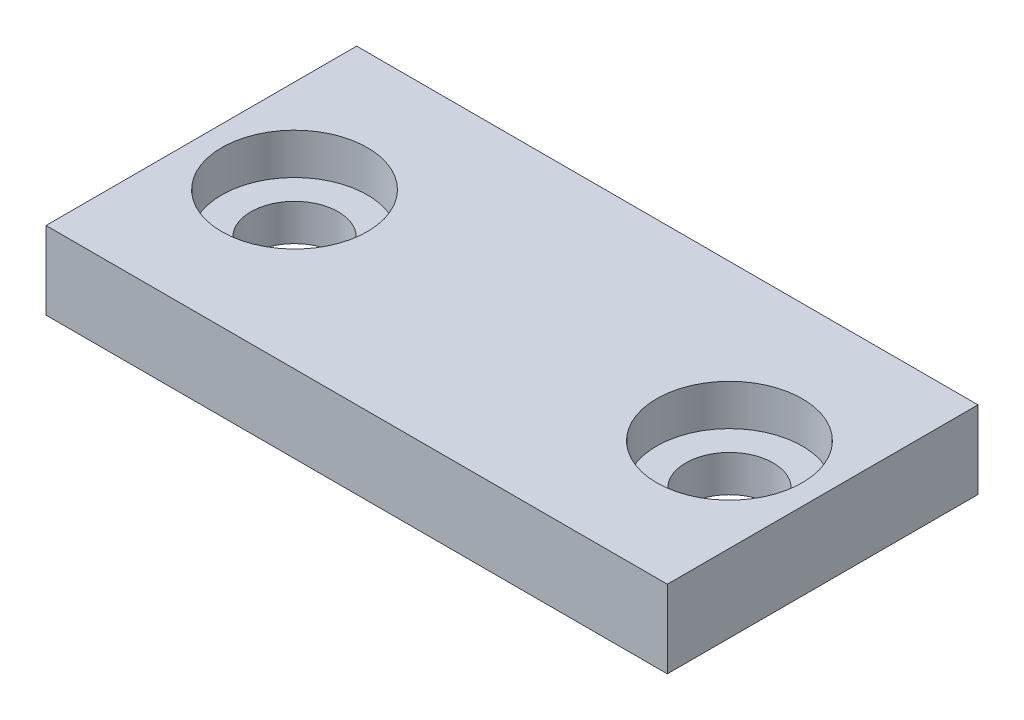
ISO-10303-21;
HEADER;
FILE_DESCRIPTION(('STEP AP214'),'2;1');
FILE_NAME('part.step','',(''),(''),'','','');
FILE_SCHEMA(('AUTOMOTIVE_DESIGN { 1 0 10303 214 1 1 1 1 }'));
ENDSEC;
DATA;
#1=APPLICATION_CONTEXT('core data for automotive mechanical design processes');
#2=APPLICATION_PROTOCOL_DEFINITION('international standard','automotive_design',2000,#1);
#3=PRODUCT_CONTEXT('',#1,'mechanical');
#4=PRODUCT('Part','Part','',(#3));
#5=PRODUCT_RELATED_PRODUCT_CATEGORY('part','',(#4));
#6=PRODUCT_DEFINITION_FORMATION('','',#4);
#7=PRODUCT_DEFINITION_CONTEXT('part definition',#1,'design');
#8=PRODUCT_DEFINITION('design','',#6,#7);
#9=PRODUCT_DEFINITION_SHAPE('','',#8);
#10=(LENGTH_UNIT() NAMED_UNIT(*) SI_UNIT(.MILLI.,.METRE.));
#11=(NAMED_UNIT(*) PLANE_ANGLE_UNIT() SI_UNIT($,.RADIAN.));
#12=(NAMED_UNIT(*) SI_UNIT($,.STERADIAN.) SOLID_ANGLE_UNIT());
#13=UNCERTAINTY_MEASURE_WITH_UNIT(LENGTH_MEASURE(1.E-05),#10,'distance_accuracy_value','');
#14=(GEOMETRIC_REPRESENTATION_CONTEXT(3) GLOBAL_UNCERTAINTY_ASSIGNED_CONTEXT((#13)) GLOBAL_UNIT_ASSIGNED_CONTEXT((#10,
#11,#12)) REPRESENTATION_CONTEXT('',''));
#15=CARTESIAN_POINT('',(0.,0.,0.));
#16=DIRECTION('',(0.,0.,1.));
#17=DIRECTION('',(1.,0.,0.));
#18=AXIS2_PLACEMENT_3D('',#15,#16,#17);
#19=CARTESIAN_POINT('',(0.,6.35,0.));
#20=DIRECTION('',(1.,0.,0.));
#21=DIRECTION('',(0.,0.,-1.));
#22=AXIS2_PLACEMENT_3D('',#19,#20,#21);
#23=PLANE('',#22);
#24=DIRECTION('',(0.,0.,1.));
#25=VECTOR('',#24,1.);
#26=CARTESIAN_POINT('',(0.,0.,0.));
#27=LINE('',#26,#25);
#28=CARTESIAN_POINT('',(0.,0.,-25.4));
#29=VERTEX_POINT('',#28);
#30=CARTESIAN_POINT('',(0.,0.,0.));
#31=VERTEX_POINT('',#30);
#32=EDGE_CURVE('E96',#29,#31,#27,.T.);
#33=ORIENTED_EDGE('',*,*,#32,.T.);
#34=DIRECTION('',(0.,-1.,0.));
#35=VECTOR('',#34,1.);
#36=CARTESIAN_POINT('',(0.,6.35,0.));
#37=LINE('',#36,#35);
#38=CARTESIAN_POINT('',(0.,6.35,0.));
#39=VERTEX_POINT('',#38);
#40=EDGE_CURVE('E11',#39,#31,#37,.T.);
#41=ORIENTED_EDGE('',*,*,#40,.F.);
#42=DIRECTION('',(0.,0.,1.));
#43=VECTOR('',#42,1.);
#44=CARTESIAN_POINT('',(0.,6.35,0.));
#45=LINE('',#44,#43);
#46=CARTESIAN_POINT('',(0.,6.35,-25.4));
#47=VERTEX_POINT('',#46);
#48=EDGE_CURVE('E84',#47,#39,#45,.T.);
#49=ORIENTED_EDGE('',*,*,#48,.F.);
#50=DIRECTION('',(0.,-1.,0.));
#51=VECTOR('',#50,1.);
#52=CARTESIAN_POINT('',(0.,6.35,-25.4));
#53=LINE('',#52,#51);
#54=EDGE_CURVE('E92',#47,#29,#53,.T.);
#55=ORIENTED_EDGE('',*,*,#54,.T.);
#56=EDGE_LOOP('',(#33,#41,#49,#55));
#57=FACE_BOUND('',#56,.T.);
#58=ADVANCED_FACE('F33',(#57),#23,.F.);
#59=CARTESIAN_POINT('',(0.,6.35,0.));
#60=DIRECTION('',(0.,0.,-1.));
#61=DIRECTION('',(-1.,0.,0.));
#62=AXIS2_PLACEMENT_3D('',#59,#60,#61);
#63=PLANE('',#62);
#64=DIRECTION('',(1.,0.,0.));
#65=VECTOR('',#64,1.);
#66=CARTESIAN_POINT('',(0.,0.,0.));
#67=LINE('',#66,#65);
#68=CARTESIAN_POINT('',(50.8,0.,0.));
#69=VERTEX_POINT('',#68);
#70=EDGE_CURVE('E88',#31,#69,#67,.T.);
#71=ORIENTED_EDGE('',*,*,#70,.T.);
#72=DIRECTION('',(0.,-1.,0.));
#73=VECTOR('',#72,1.);
#74=CARTESIAN_POINT('',(50.8,6.35,0.));
#75=LINE('',#74,#73);
#76=CARTESIAN_POINT('',(50.8,6.35,0.));
#77=VERTEX_POINT('',#76);
#78=EDGE_CURVE('E41',#77,#69,#75,.T.);
#79=ORIENTED_EDGE('',*,*,#78,.F.);
#80=DIRECTION('',(1.,0.,0.));
#81=VECTOR('',#80,1.);
#82=CARTESIAN_POINT('',(0.,6.35,0.));
#83=LINE('',#82,#81);
#84=EDGE_CURVE('E79',#39,#77,#83,.T.);
#85=ORIENTED_EDGE('',*,*,#84,.F.);
#86=ORIENTED_EDGE('',*,*,#40,.T.);
#87=EDGE_LOOP('',(#71,#79,#85,#86));
#88=FACE_BOUND('',#87,.T.);
#89=ADVANCED_FACE('F87',(#88),#63,.F.);
#90=CARTESIAN_POINT('',(50.8,6.35,0.));
#91=DIRECTION('',(-1.,0.,0.));
#92=DIRECTION('',(0.,0.,1.));
#93=AXIS2_PLACEMENT_3D('',#90,#91,#92);
#94=PLANE('',#93);
#95=DIRECTION('',(0.,0.,-1.));
#96=VECTOR('',#95,1.);
#97=CARTESIAN_POINT('',(50.8,0.,0.));
#98=LINE('',#97,#96);
#99=CARTESIAN_POINT('',(50.8,0.,-25.4));
#100=VERTEX_POINT('',#99);
#101=EDGE_CURVE('E66',#69,#100,#98,.T.);
#102=ORIENTED_EDGE('',*,*,#101,.T.);
#103=DIRECTION('',(0.,-1.,0.));
#104=VECTOR('',#103,1.);
#105=CARTESIAN_POINT('',(50.8,6.35,-25.4));
#106=LINE('',#105,#104);
#107=CARTESIAN_POINT('',(50.8,6.35,-25.4));
#108=VERTEX_POINT('',#107);
#109=EDGE_CURVE('E89',#108,#100,#106,.T.);
#110=ORIENTED_EDGE('',*,*,#109,.F.);
#111=DIRECTION('',(0.,0.,-1.));
#112=VECTOR('',#111,1.);
#113=CARTESIAN_POINT('',(50.8,6.35,0.));
#114=LINE('',#113,#112);
#115=EDGE_CURVE('E82',#77,#108,#114,.T.);
#116=ORIENTED_EDGE('',*,*,#115,.F.);
#117=ORIENTED_EDGE('',*,*,#78,.T.);
#118=EDGE_LOOP('',(#102,#110,#116,#117));
#119=FACE_BOUND('',#118,.T.);
#120=ADVANCED_FACE('F90',(#119),#94,.F.);
#121=CARTESIAN_POINT('',(0.,6.35,-25.4));
#122=DIRECTION('',(0.,0.,1.));
#123=DIRECTION('',(1.,0.,0.));
#124=AXIS2_PLACEMENT_3D('',#121,#122,#123);
#125=PLANE('',#124);
#126=DIRECTION('',(-1.,0.,0.));
#127=VECTOR('',#126,1.);
#128=CARTESIAN_POINT('',(0.,0.,-25.4));
#129=LINE('',#128,#127);
#130=EDGE_CURVE('E72',#100,#29,#129,.T.);
#131=ORIENTED_EDGE('',*,*,#130,.T.);
#132=ORIENTED_EDGE('',*,*,#54,.F.);
#133=DIRECTION('',(-1.,0.,0.));
#134=VECTOR('',#133,1.);
#135=CARTESIAN_POINT('',(0.,6.35,-25.4));
#136=LINE('',#135,#134);
#137=EDGE_CURVE('E49',#108,#47,#136,.T.);
#138=ORIENTED_EDGE('',*,*,#137,.F.);
#139=ORIENTED_EDGE('',*,*,#109,.T.);
#140=EDGE_LOOP('',(#131,#132,#138,#139));
#141=FACE_BOUND('',#140,.T.);
#142=ADVANCED_FACE('F104',(#141),#125,.F.);
#143=CARTESIAN_POINT('',(0.,6.35,0.));
#144=DIRECTION('',(0.,-1.,0.));
#145=DIRECTION('',(0.,0.,-1.));
#146=AXIS2_PLACEMENT_3D('',#143,#144,#145);
#147=PLANE('',#146);
#148=CARTESIAN_POINT('',(7.62,6.35,-12.7));
#149=DIRECTION('',(0.,1.,0.));
#150=DIRECTION('',(0.,0.,1.));
#151=AXIS2_PLACEMENT_3D('',#148,#149,#150);
#152=CIRCLE('',#151,5.95376);
#153=CARTESIAN_POINT('',(7.62,6.35,-6.74624));
#154=VERTEX_POINT('',#153);
#155=EDGE_CURVE('E130',#154,#154,#152,.T.);
#156=ORIENTED_EDGE('',*,*,#155,.F.);
#157=EDGE_LOOP('',(#156));
#158=FACE_BOUND('',#157,.T.);
#159=CARTESIAN_POINT('',(43.18,6.35,-12.7));
#160=DIRECTION('',(0.,1.,0.));
#161=DIRECTION('',(0.,0.,1.));
#162=AXIS2_PLACEMENT_3D('',#159,#160,#161);
#163=CIRCLE('',#162,5.95376);
#164=CARTESIAN_POINT('',(43.18,6.35,-6.74624));
#165=VERTEX_POINT('',#164);
#166=EDGE_CURVE('E118',#165,#165,#163,.T.);
#167=ORIENTED_EDGE('',*,*,#166,.F.);
#168=EDGE_LOOP('',(#167));
#169=FACE_BOUND('',#168,.T.);
#170=ORIENTED_EDGE('',*,*,#48,.T.);
#171=ORIENTED_EDGE('',*,*,#84,.T.);
#172=ORIENTED_EDGE('',*,*,#115,.T.);
#173=ORIENTED_EDGE('',*,*,#137,.T.);
#174=EDGE_LOOP('',(#170,#171,#172,#173));
#175=FACE_BOUND('',#174,.T.);
#176=ADVANCED_FACE('F80',(#158,#169,#175),#147,.F.);
#177=CARTESIAN_POINT('',(0.,0.,0.));
#178=DIRECTION('',(0.,-1.,0.));
#179=DIRECTION('',(0.,0.,-1.));
#180=AXIS2_PLACEMENT_3D('',#177,#178,#179);
#181=PLANE('',#180);
#182=CARTESIAN_POINT('',(7.62,0.,-12.7));
#183=DIRECTION('',(0.,1.,0.));
#184=DIRECTION('',(0.,0.,1.));
#185=AXIS2_PLACEMENT_3D('',#182,#183,#184);
#186=CIRCLE('',#185,3.57124);
#187=CARTESIAN_POINT('',(7.62,0.,-9.12876));
#188=VERTEX_POINT('',#187);
#189=EDGE_CURVE('E121',#188,#188,#186,.T.);
#190=ORIENTED_EDGE('',*,*,#189,.T.);
#191=EDGE_LOOP('',(#190));
#192=FACE_BOUND('',#191,.T.);
#193=CARTESIAN_POINT('',(43.18,0.,-12.7));
#194=DIRECTION('',(0.,1.,0.));
#195=DIRECTION('',(0.,0.,1.));
#196=AXIS2_PLACEMENT_3D('',#193,#194,#195);
#197=CIRCLE('',#196,3.57124);
#198=CARTESIAN_POINT('',(43.18,0.,-9.12876));
#199=VERTEX_POINT('',#198);
#200=EDGE_CURVE('E99',#199,#199,#197,.T.);
#201=ORIENTED_EDGE('',*,*,#200,.T.);
#202=EDGE_LOOP('',(#201));
#203=FACE_BOUND('',#202,.T.);
#204=ORIENTED_EDGE('',*,*,#32,.F.);
#205=ORIENTED_EDGE('',*,*,#130,.F.);
#206=ORIENTED_EDGE('',*,*,#101,.F.);
#207=ORIENTED_EDGE('',*,*,#70,.F.);
#208=EDGE_LOOP('',(#204,#205,#206,#207));
#209=FACE_BOUND('',#208,.T.);
#210=ADVANCED_FACE('F107',(#192,#203,#209),#181,.T.);
#211=CARTESIAN_POINT('',(43.18,6.35,-12.7));
#212=DIRECTION('',(0.,1.,0.));
#213=DIRECTION('',(0.,0.,1.));
#214=AXIS2_PLACEMENT_3D('',#211,#212,#213);
#215=CYLINDRICAL_SURFACE('',#214,3.57124);
#216=ORIENTED_EDGE('',*,*,#200,.F.);
#217=EDGE_LOOP('',(#216));
#218=FACE_BOUND('',#217,.T.);
#219=CARTESIAN_POINT('',(43.18,2.9972,-12.7));
#220=DIRECTION('',(0.,1.,0.));
#221=DIRECTION('',(0.,0.,1.));
#222=AXIS2_PLACEMENT_3D('',#219,#220,#221);
#223=CIRCLE('',#222,3.57124);
#224=CARTESIAN_POINT('',(43.18,2.9972,-9.12876));
#225=VERTEX_POINT('',#224);
#226=EDGE_CURVE('E112',#225,#225,#223,.T.);
#227=ORIENTED_EDGE('',*,*,#226,.T.);
#228=EDGE_LOOP('',(#227));
#229=FACE_BOUND('',#228,.T.);
#230=ADVANCED_FACE('F154',(#218,#229),#215,.F.);
#231=CARTESIAN_POINT('',(46.75124,2.9972,-12.7));
#232=DIRECTION('',(0.,-1.,0.));
#233=DIRECTION('',(0.,0.,-1.));
#234=AXIS2_PLACEMENT_3D('',#231,#232,#233);
#235=PLANE('',#234);
#236=ORIENTED_EDGE('',*,*,#226,.F.);
#237=EDGE_LOOP('',(#236));
#238=FACE_BOUND('',#237,.T.);
#239=CARTESIAN_POINT('',(43.18,2.9972,-12.7));
#240=DIRECTION('',(0.,1.,0.));
#241=DIRECTION('',(0.,0.,1.));
#242=AXIS2_PLACEMENT_3D('',#239,#240,#241);
#243=CIRCLE('',#242,5.95376);
#244=CARTESIAN_POINT('',(43.18,2.9972,-6.74624));
#245=VERTEX_POINT('',#244);
#246=EDGE_CURVE('E115',#245,#245,#243,.T.);
#247=ORIENTED_EDGE('',*,*,#246,.T.);
#248=EDGE_LOOP('',(#247));
#249=FACE_BOUND('',#248,.T.);
#250=ADVANCED_FACE('F144',(#238,#249),#235,.F.);
#251=CARTESIAN_POINT('',(43.18,6.35,-12.7));
#252=DIRECTION('',(0.,1.,0.));
#253=DIRECTION('',(0.,0.,1.));
#254=AXIS2_PLACEMENT_3D('',#251,#252,#253);
#255=CYLINDRICAL_SURFACE('',#254,5.95376);
#256=ORIENTED_EDGE('',*,*,#246,.F.);
#257=EDGE_LOOP('',(#256));
#258=FACE_BOUND('',#257,.T.);
#259=ORIENTED_EDGE('',*,*,#166,.T.);
#260=EDGE_LOOP('',(#259));
#261=FACE_BOUND('',#260,.T.);
#262=ADVANCED_FACE('F141',(#258,#261),#255,.F.);
#263=CARTESIAN_POINT('',(7.62,6.35,-12.7));
#264=DIRECTION('',(0.,1.,0.));
#265=DIRECTION('',(0.,0.,1.));
#266=AXIS2_PLACEMENT_3D('',#263,#264,#265);
#267=CYLINDRICAL_SURFACE('',#266,3.57124);
#268=ORIENTED_EDGE('',*,*,#189,.F.);
#269=EDGE_LOOP('',(#268));
#270=FACE_BOUND('',#269,.T.);
#271=CARTESIAN_POINT('',(7.62,2.9972,-12.7));
#272=DIRECTION('',(0.,1.,0.));
#273=DIRECTION('',(0.,0.,1.));
#274=AXIS2_PLACEMENT_3D('',#271,#272,#273);
#275=CIRCLE('',#274,3.57124);
#276=CARTESIAN_POINT('',(7.62,2.9972,-9.12876));
#277=VERTEX_POINT('',#276);
#278=EDGE_CURVE('E124',#277,#277,#275,.T.);
#279=ORIENTED_EDGE('',*,*,#278,.T.);
#280=EDGE_LOOP('',(#279));
#281=FACE_BOUND('',#280,.T.);
#282=ADVANCED_FACE('F143',(#270,#281),#267,.F.);
#283=CARTESIAN_POINT('',(11.19124,2.9972,-12.7));
#284=DIRECTION('',(0.,-1.,0.));
#285=DIRECTION('',(0.,0.,-1.));
#286=AXIS2_PLACEMENT_3D('',#283,#284,#285);
#287=PLANE('',#286);
#288=ORIENTED_EDGE('',*,*,#278,.F.);
#289=EDGE_LOOP('',(#288));
#290=FACE_BOUND('',#289,.T.);
#291=CARTESIAN_POINT('',(7.62,2.9972,-12.7));
#292=DIRECTION('',(0.,1.,0.));
#293=DIRECTION('',(0.,0.,1.));
#294=AXIS2_PLACEMENT_3D('',#291,#292,#293);
#295=CIRCLE('',#294,5.95376);
#296=CARTESIAN_POINT('',(7.62,2.9972,-6.74624));
#297=VERTEX_POINT('',#296);
#298=EDGE_CURVE('E127',#297,#297,#295,.T.);
#299=ORIENTED_EDGE('',*,*,#298,.T.);
#300=EDGE_LOOP('',(#299));
#301=FACE_BOUND('',#300,.T.);
#302=ADVANCED_FACE('F151',(#290,#301),#287,.F.);
#303=CARTESIAN_POINT('',(7.62,6.35,-12.7));
#304=DIRECTION('',(0.,1.,0.));
#305=DIRECTION('',(0.,0.,1.));
#306=AXIS2_PLACEMENT_3D('',#303,#304,#305);
#307=CYLINDRICAL_SURFACE('',#306,5.95376);
#308=ORIENTED_EDGE('',*,*,#298,.F.);
#309=EDGE_LOOP('',(#308));
#310=FACE_BOUND('',#309,.T.);
#311=ORIENTED_EDGE('',*,*,#155,.T.);
#312=EDGE_LOOP('',(#311));
#313=FACE_BOUND('',#312,.T.);
#314=ADVANCED_FACE('F134',(#310,#313),#307,.F.);
#315=CLOSED_SHELL('',(#58,#89,#120,#142,#176,#210,#230,#250,#262,#282,#302,#314));
#316=MANIFOLD_SOLID_BREP('B2',#315);
#317=ADVANCED_BREP_SHAPE_REPRESENTATION('',(#18,#316),#14);
#318=SHAPE_DEFINITION_REPRESENTATION(#9,#317);
ENDSEC;
END-ISO-10303-21;
